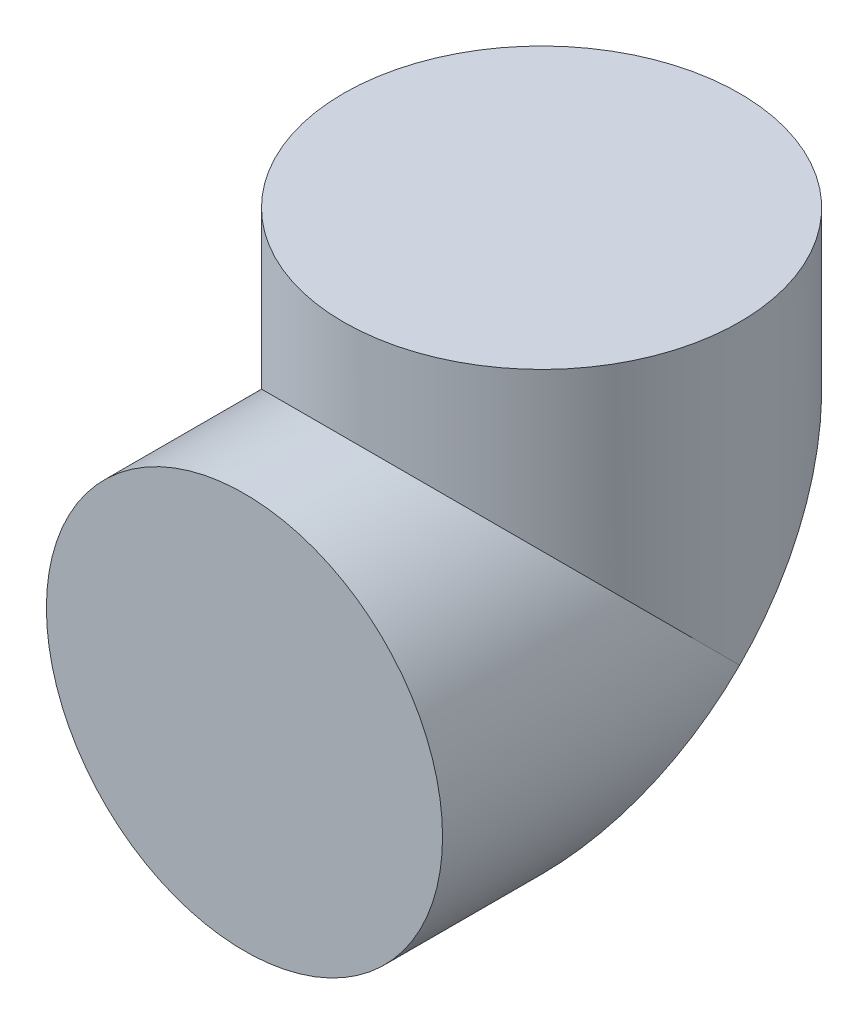
ISO-10303-21;
HEADER;
FILE_DESCRIPTION(('STEP AP214'),'2;1');
FILE_NAME('part.step','',(''),(''),'','','');
FILE_SCHEMA(('AUTOMOTIVE_DESIGN { 1 0 10303 214 1 1 1 1 }'));
ENDSEC;
DATA;
#1=APPLICATION_CONTEXT('core data for automotive mechanical design processes');
#2=APPLICATION_PROTOCOL_DEFINITION('international standard','automotive_design',2000,#1);
#3=PRODUCT_CONTEXT('',#1,'mechanical');
#4=PRODUCT('Part','Part','',(#3));
#5=PRODUCT_RELATED_PRODUCT_CATEGORY('part','',(#4));
#6=PRODUCT_DEFINITION_FORMATION('','',#4);
#7=PRODUCT_DEFINITION_CONTEXT('part definition',#1,'design');
#8=PRODUCT_DEFINITION('design','',#6,#7);
#9=PRODUCT_DEFINITION_SHAPE('','',#8);
#10=(LENGTH_UNIT() NAMED_UNIT(*) SI_UNIT(.MILLI.,.METRE.));
#11=(NAMED_UNIT(*) PLANE_ANGLE_UNIT() SI_UNIT($,.RADIAN.));
#12=(NAMED_UNIT(*) SI_UNIT($,.STERADIAN.) SOLID_ANGLE_UNIT());
#13=UNCERTAINTY_MEASURE_WITH_UNIT(LENGTH_MEASURE(1.E-05),#10,'distance_accuracy_value','');
#14=(GEOMETRIC_REPRESENTATION_CONTEXT(3) GLOBAL_UNCERTAINTY_ASSIGNED_CONTEXT((#13)) GLOBAL_UNIT_ASSIGNED_CONTEXT((#10,
#11,#12)) REPRESENTATION_CONTEXT('',''));
#15=CARTESIAN_POINT('',(0.,0.,0.));
#16=DIRECTION('',(0.,0.,1.));
#17=DIRECTION('',(1.,0.,0.));
#18=AXIS2_PLACEMENT_3D('',#15,#16,#17);
#19=CARTESIAN_POINT('',(0.,50.,20.));
#20=DIRECTION('',(0.,-1.,0.));
#21=DIRECTION('',(0.,0.,-1.));
#22=AXIS2_PLACEMENT_3D('',#19,#20,#21);
#23=CYLINDRICAL_SURFACE('',#22,20.);
#24=CARTESIAN_POINT('',(0.,50.,20.));
#25=DIRECTION('',(0.,1.,0.));
#26=DIRECTION('',(0.,0.,1.));
#27=AXIS2_PLACEMENT_3D('',#24,#25,#26);
#28=CIRCLE('',#27,20.);
#29=CARTESIAN_POINT('',(0.,50.,40.));
#30=VERTEX_POINT('',#29);
#31=EDGE_CURVE('E11',#30,#30,#28,.T.);
#32=ORIENTED_EDGE('',*,*,#31,.F.);
#33=EDGE_LOOP('',(#32));
#34=FACE_BOUND('',#33,.T.);
#35=CARTESIAN_POINT('',(0.,20.,20.));
#36=DIRECTION('',(0.,-0.707106781186547,-0.707106781186547));
#37=DIRECTION('',(0.,-0.707106781186547,0.707106781186547));
#38=AXIS2_PLACEMENT_3D('',#35,#36,#37);
#39=ELLIPSE('',#38,28.2842712474619,20.);
#40=CARTESIAN_POINT('',(-20.,20.,20.));
#41=VERTEX_POINT('',#40);
#42=CARTESIAN_POINT('',(20.,20.,20.));
#43=VERTEX_POINT('',#42);
#44=EDGE_CURVE('E49',#41,#43,#39,.T.);
#45=ORIENTED_EDGE('',*,*,#44,.F.);
#46=CARTESIAN_POINT('',(0.,20.,20.));
#47=DIRECTION('',(0.,-0.707106781186547,0.707106781186547));
#48=DIRECTION('',(0.,-0.707106781186547,-0.707106781186547));
#49=AXIS2_PLACEMENT_3D('',#46,#47,#48);
#50=ELLIPSE('',#49,28.2842712474619,20.);
#51=EDGE_CURVE('E55',#43,#41,#50,.T.);
#52=ORIENTED_EDGE('',*,*,#51,.F.);
#53=EDGE_LOOP('',(#45,#52));
#54=FACE_BOUND('',#53,.T.);
#55=ADVANCED_FACE('F36',(#34,#54),#23,.T.);
#56=CARTESIAN_POINT('',(0.,50.,20.));
#57=DIRECTION('',(0.,1.,0.));
#58=DIRECTION('',(0.,0.,1.));
#59=AXIS2_PLACEMENT_3D('',#56,#57,#58);
#60=PLANE('',#59);
#61=ORIENTED_EDGE('',*,*,#31,.T.);
#62=EDGE_LOOP('',(#61));
#63=FACE_BOUND('',#62,.T.);
#64=ADVANCED_FACE('F68',(#63),#60,.T.);
#65=CARTESIAN_POINT('',(0.,20.,50.));
#66=DIRECTION('',(0.,0.,-1.));
#67=DIRECTION('',(-1.,0.,0.));
#68=AXIS2_PLACEMENT_3D('',#65,#66,#67);
#69=CYLINDRICAL_SURFACE('',#68,20.);
#70=CARTESIAN_POINT('',(0.,20.,50.));
#71=DIRECTION('',(0.,0.,1.));
#72=DIRECTION('',(1.,0.,0.));
#73=AXIS2_PLACEMENT_3D('',#70,#71,#72);
#74=CIRCLE('',#73,20.);
#75=CARTESIAN_POINT('',(20.,20.,50.));
#76=VERTEX_POINT('',#75);
#77=EDGE_CURVE('E59',#76,#76,#74,.T.);
#78=ORIENTED_EDGE('',*,*,#77,.F.);
#79=EDGE_LOOP('',(#78));
#80=FACE_BOUND('',#79,.T.);
#81=ORIENTED_EDGE('',*,*,#51,.T.);
#82=CARTESIAN_POINT('',(0.,20.,20.));
#83=DIRECTION('',(0.,-0.707106781186547,-0.707106781186547));
#84=DIRECTION('',(0.,-0.707106781186547,0.707106781186547));
#85=AXIS2_PLACEMENT_3D('',#82,#83,#84);
#86=ELLIPSE('',#85,28.2842712474619,20.);
#87=EDGE_CURVE('E43',#41,#43,#86,.F.);
#88=ORIENTED_EDGE('',*,*,#87,.T.);
#89=EDGE_LOOP('',(#81,#88));
#90=FACE_BOUND('',#89,.T.);
#91=ADVANCED_FACE('F54',(#80,#90),#69,.T.);
#92=CARTESIAN_POINT('',(0.,20.,50.));
#93=DIRECTION('',(0.,0.,1.));
#94=DIRECTION('',(1.,0.,0.));
#95=AXIS2_PLACEMENT_3D('',#92,#93,#94);
#96=PLANE('',#95);
#97=ORIENTED_EDGE('',*,*,#77,.T.);
#98=EDGE_LOOP('',(#97));
#99=FACE_BOUND('',#98,.T.);
#100=ADVANCED_FACE('F65',(#99),#96,.T.);
#101=CARTESIAN_POINT('',(-40.,40.,0.));
#102=DIRECTION('',(0.,0.707106781186548,0.707106781186548));
#103=DIRECTION('',(0.,-0.707106781186548,0.707106781186548));
#104=AXIS2_PLACEMENT_3D('',#101,#102,#103);
#105=PLANE('',#104);
#106=ORIENTED_EDGE('',*,*,#87,.F.);
#107=ORIENTED_EDGE('',*,*,#44,.T.);
#108=EDGE_LOOP('',(#106,#107));
#109=FACE_BOUND('',#108,.T.);
#110=ADVANCED_FACE('F57',(#109),#105,.F.);
#111=CLOSED_SHELL('',(#55,#64,#91,#100,#110));
#112=MANIFOLD_SOLID_BREP('B2',#111);
#113=ADVANCED_BREP_SHAPE_REPRESENTATION('',(#18,#112),#14);
#114=SHAPE_DEFINITION_REPRESENTATION(#9,#113);
ENDSEC;
END-ISO-10303-21;
